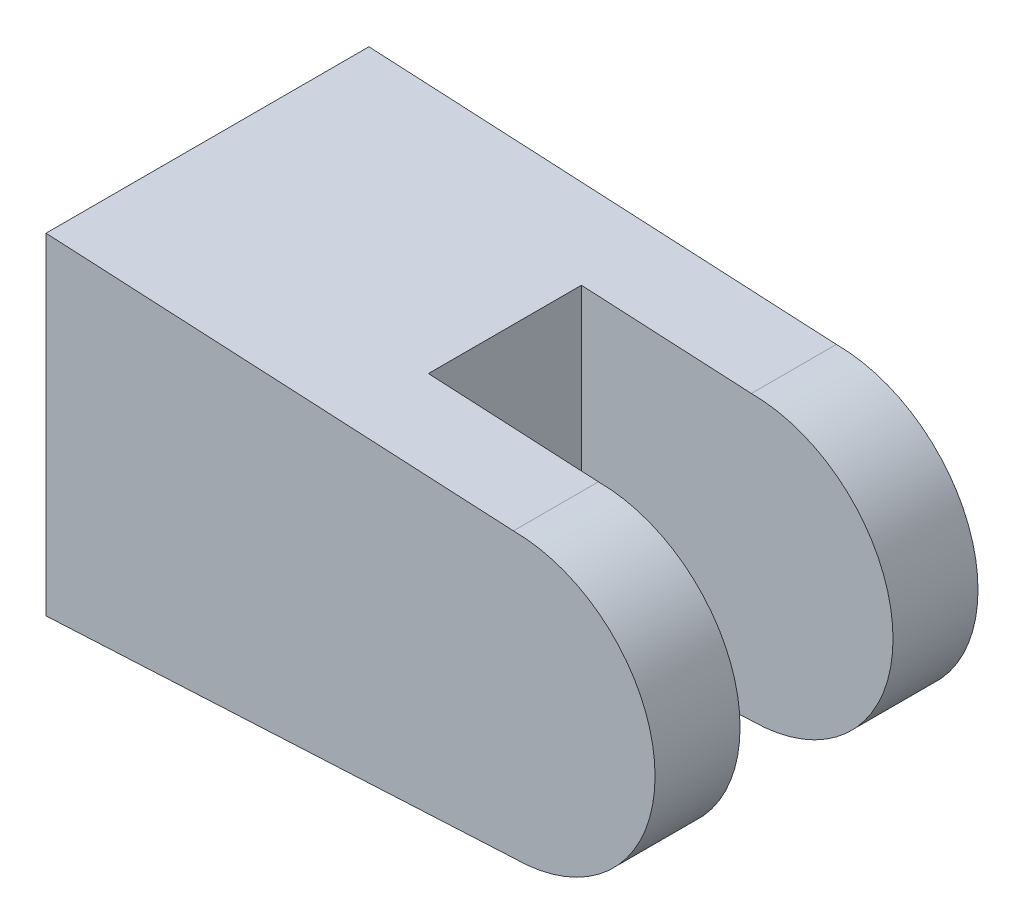
ISO-10303-21;
HEADER;
FILE_DESCRIPTION(('STEP AP214'),'2;1');
FILE_NAME('part.step','',(''),(''),'','','');
FILE_SCHEMA(('AUTOMOTIVE_DESIGN { 1 0 10303 214 1 1 1 1 }'));
ENDSEC;
DATA;
#1=APPLICATION_CONTEXT('core data for automotive mechanical design processes');
#2=APPLICATION_PROTOCOL_DEFINITION('international standard','automotive_design',2000,#1);
#3=PRODUCT_CONTEXT('',#1,'mechanical');
#4=PRODUCT('Part','Part','',(#3));
#5=PRODUCT_RELATED_PRODUCT_CATEGORY('part','',(#4));
#6=PRODUCT_DEFINITION_FORMATION('','',#4);
#7=PRODUCT_DEFINITION_CONTEXT('part definition',#1,'design');
#8=PRODUCT_DEFINITION('design','',#6,#7);
#9=PRODUCT_DEFINITION_SHAPE('','',#8);
#10=(LENGTH_UNIT() NAMED_UNIT(*) SI_UNIT(.MILLI.,.METRE.));
#11=(NAMED_UNIT(*) PLANE_ANGLE_UNIT() SI_UNIT($,.RADIAN.));
#12=(NAMED_UNIT(*) SI_UNIT($,.STERADIAN.) SOLID_ANGLE_UNIT());
#13=UNCERTAINTY_MEASURE_WITH_UNIT(LENGTH_MEASURE(1.E-05),#10,'distance_accuracy_value','');
#14=(GEOMETRIC_REPRESENTATION_CONTEXT(3) GLOBAL_UNCERTAINTY_ASSIGNED_CONTEXT((#13)) GLOBAL_UNIT_ASSIGNED_CONTEXT((#10,
#11,#12)) REPRESENTATION_CONTEXT('',''));
#15=CARTESIAN_POINT('',(0.,0.,0.));
#16=DIRECTION('',(0.,0.,1.));
#17=DIRECTION('',(1.,0.,0.));
#18=AXIS2_PLACEMENT_3D('',#15,#16,#17);
#19=CARTESIAN_POINT('',(0.,0.,57.));
#20=DIRECTION('',(0.,0.,-1.));
#21=DIRECTION('',(-1.,0.,0.));
#22=AXIS2_PLACEMENT_3D('',#19,#20,#21);
#23=CYLINDRICAL_SURFACE('',#22,50.);
#24=DIRECTION('',(0.,0.,-1.));
#25=VECTOR('',#24,1.);
#26=CARTESIAN_POINT('',(0.,-50.,57.));
#27=LINE('',#26,#25);
#28=CARTESIAN_POINT('',(0.,-50.,57.));
#29=VERTEX_POINT('',#28);
#30=CARTESIAN_POINT('',(0.,-50.,27.));
#31=VERTEX_POINT('',#30);
#32=EDGE_CURVE('E155',#29,#31,#27,.T.);
#33=ORIENTED_EDGE('',*,*,#32,.T.);
#34=CARTESIAN_POINT('',(0.,0.,27.));
#35=DIRECTION('',(0.,0.,1.));
#36=DIRECTION('',(1.,0.,0.));
#37=AXIS2_PLACEMENT_3D('',#34,#35,#36);
#38=CIRCLE('',#37,50.);
#39=CARTESIAN_POINT('',(0.,50.,27.));
#40=VERTEX_POINT('',#39);
#41=EDGE_CURVE('E126',#31,#40,#38,.T.);
#42=ORIENTED_EDGE('',*,*,#41,.T.);
#43=DIRECTION('',(0.,0.,-1.));
#44=VECTOR('',#43,1.);
#45=CARTESIAN_POINT('',(0.,50.,57.));
#46=LINE('',#45,#44);
#47=CARTESIAN_POINT('',(0.,50.,57.));
#48=VERTEX_POINT('',#47);
#49=EDGE_CURVE('E141',#48,#40,#46,.T.);
#50=ORIENTED_EDGE('',*,*,#49,.F.);
#51=CARTESIAN_POINT('',(0.,0.,57.));
#52=DIRECTION('',(0.,0.,1.));
#53=DIRECTION('',(1.,0.,0.));
#54=AXIS2_PLACEMENT_3D('',#51,#52,#53);
#55=CIRCLE('',#54,50.);
#56=EDGE_CURVE('E142',#29,#48,#55,.T.);
#57=ORIENTED_EDGE('',*,*,#56,.F.);
#58=EDGE_LOOP('',(#33,#42,#50,#57));
#59=FACE_BOUND('',#58,.T.);
#60=ADVANCED_FACE('F34',(#59),#23,.T.);
#61=CARTESIAN_POINT('',(0.,0.,-27.));
#62=DIRECTION('',(0.,0.,-1.));
#63=DIRECTION('',(-1.,0.,0.));
#64=AXIS2_PLACEMENT_3D('',#61,#62,#63);
#65=CIRCLE('',#64,50.);
#66=CARTESIAN_POINT('',(0.,50.,-27.));
#67=VERTEX_POINT('',#66);
#68=CARTESIAN_POINT('',(0.,-50.,-27.));
#69=VERTEX_POINT('',#68);
#70=EDGE_CURVE('E110',#67,#69,#65,.T.);
#71=ORIENTED_EDGE('',*,*,#70,.T.);
#72=CARTESIAN_POINT('',(0.,-50.,-57.));
#73=VERTEX_POINT('',#72);
#74=EDGE_CURVE('E80',#69,#73,#27,.T.);
#75=ORIENTED_EDGE('',*,*,#74,.T.);
#76=CARTESIAN_POINT('',(0.,0.,-57.));
#77=DIRECTION('',(0.,0.,1.));
#78=DIRECTION('',(1.,0.,0.));
#79=AXIS2_PLACEMENT_3D('',#76,#77,#78);
#80=CIRCLE('',#79,50.);
#81=CARTESIAN_POINT('',(0.,50.,-57.));
#82=VERTEX_POINT('',#81);
#83=EDGE_CURVE('E136',#73,#82,#80,.T.);
#84=ORIENTED_EDGE('',*,*,#83,.T.);
#85=EDGE_CURVE('E164',#67,#82,#46,.T.);
#86=ORIENTED_EDGE('',*,*,#85,.F.);
#87=EDGE_LOOP('',(#71,#75,#84,#86));
#88=FACE_BOUND('',#87,.T.);
#89=ADVANCED_FACE('F36',(#88),#23,.T.);
#90=CARTESIAN_POINT('',(0.,50.,57.));
#91=DIRECTION('',(-0.0514469315337123,-0.998675729772064,0.));
#92=DIRECTION('',(0.998675729772065,-0.0514469315337123,0.));
#93=AXIS2_PLACEMENT_3D('',#90,#91,#92);
#94=PLANE('',#93);
#95=ORIENTED_EDGE('',*,*,#49,.T.);
#96=DIRECTION('',(-0.998675729772065,0.0514469315337123,0.));
#97=VECTOR('',#96,1.);
#98=CARTESIAN_POINT('',(0.,50.,27.));
#99=LINE('',#98,#97);
#100=CARTESIAN_POINT('',(-60.,53.0909090909091,27.));
#101=VERTEX_POINT('',#100);
#102=EDGE_CURVE('E125',#40,#101,#99,.T.);
#103=ORIENTED_EDGE('',*,*,#102,.T.);
#104=DIRECTION('',(0.,0.,-1.));
#105=VECTOR('',#104,1.);
#106=CARTESIAN_POINT('',(-60.,53.0909090909091,57.));
#107=LINE('',#106,#105);
#108=CARTESIAN_POINT('',(-60.,53.0909090909091,-27.));
#109=VERTEX_POINT('',#108);
#110=EDGE_CURVE('E113',#101,#109,#107,.T.);
#111=ORIENTED_EDGE('',*,*,#110,.T.);
#112=DIRECTION('',(0.998675729772065,-0.0514469315337123,0.));
#113=VECTOR('',#112,1.);
#114=CARTESIAN_POINT('',(0.,50.,-27.));
#115=LINE('',#114,#113);
#116=EDGE_CURVE('E108',#109,#67,#115,.T.);
#117=ORIENTED_EDGE('',*,*,#116,.T.);
#118=ORIENTED_EDGE('',*,*,#85,.T.);
#119=DIRECTION('',(-0.998675729772065,0.0514469315337123,0.));
#120=VECTOR('',#119,1.);
#121=CARTESIAN_POINT('',(0.,50.,-57.));
#122=LINE('',#121,#120);
#123=CARTESIAN_POINT('',(-165.,58.5,-57.));
#124=VERTEX_POINT('',#123);
#125=EDGE_CURVE('E150',#82,#124,#122,.T.);
#126=ORIENTED_EDGE('',*,*,#125,.T.);
#127=DIRECTION('',(0.,0.,-1.));
#128=VECTOR('',#127,1.);
#129=CARTESIAN_POINT('',(-165.,58.5,57.));
#130=LINE('',#129,#128);
#131=CARTESIAN_POINT('',(-165.,58.5,57.));
#132=VERTEX_POINT('',#131);
#133=EDGE_CURVE('E161',#132,#124,#130,.T.);
#134=ORIENTED_EDGE('',*,*,#133,.F.);
#135=DIRECTION('',(-0.998675729772065,0.0514469315337123,0.));
#136=VECTOR('',#135,1.);
#137=CARTESIAN_POINT('',(0.,50.,57.));
#138=LINE('',#137,#136);
#139=EDGE_CURVE('E88',#48,#132,#138,.T.);
#140=ORIENTED_EDGE('',*,*,#139,.F.);
#141=EDGE_LOOP('',(#95,#103,#111,#117,#118,#126,#134,#140));
#142=FACE_BOUND('',#141,.T.);
#143=ADVANCED_FACE('F124',(#142),#94,.F.);
#144=CARTESIAN_POINT('',(-165.,58.5,57.));
#145=DIRECTION('',(1.,0.,0.));
#146=DIRECTION('',(0.,0.,-1.));
#147=AXIS2_PLACEMENT_3D('',#144,#145,#146);
#148=PLANE('',#147);
#149=CARTESIAN_POINT('',(-165.,0.,0.));
#150=DIRECTION('',(-1.,0.,0.));
#151=DIRECTION('',(0.,0.,1.));
#152=AXIS2_PLACEMENT_3D('',#149,#150,#151);
#153=CIRCLE('',#152,37.5);
#154=CARTESIAN_POINT('',(-165.,0.,37.5));
#155=VERTEX_POINT('',#154);
#156=EDGE_CURVE('E137',#155,#155,#153,.T.);
#157=ORIENTED_EDGE('',*,*,#156,.F.);
#158=EDGE_LOOP('',(#157));
#159=FACE_BOUND('',#158,.T.);
#160=DIRECTION('',(0.,-1.,0.));
#161=VECTOR('',#160,1.);
#162=CARTESIAN_POINT('',(-165.,58.5,-57.));
#163=LINE('',#162,#161);
#164=CARTESIAN_POINT('',(-165.,-58.5,-57.));
#165=VERTEX_POINT('',#164);
#166=EDGE_CURVE('E152',#124,#165,#163,.T.);
#167=ORIENTED_EDGE('',*,*,#166,.T.);
#168=DIRECTION('',(0.,0.,-1.));
#169=VECTOR('',#168,1.);
#170=CARTESIAN_POINT('',(-165.,-58.5,57.));
#171=LINE('',#170,#169);
#172=CARTESIAN_POINT('',(-165.,-58.5,57.));
#173=VERTEX_POINT('',#172);
#174=EDGE_CURVE('E158',#173,#165,#171,.T.);
#175=ORIENTED_EDGE('',*,*,#174,.F.);
#176=DIRECTION('',(0.,-1.,0.));
#177=VECTOR('',#176,1.);
#178=CARTESIAN_POINT('',(-165.,58.5,57.));
#179=LINE('',#178,#177);
#180=EDGE_CURVE('E146',#132,#173,#179,.T.);
#181=ORIENTED_EDGE('',*,*,#180,.F.);
#182=ORIENTED_EDGE('',*,*,#133,.T.);
#183=EDGE_LOOP('',(#167,#175,#181,#182));
#184=FACE_BOUND('',#183,.T.);
#185=ADVANCED_FACE('F177',(#159,#184),#148,.F.);
#186=CARTESIAN_POINT('',(0.,-50.,57.));
#187=DIRECTION('',(-0.0514469315337123,0.998675729772064,0.));
#188=DIRECTION('',(-0.998675729772065,-0.0514469315337123,0.));
#189=AXIS2_PLACEMENT_3D('',#186,#187,#188);
#190=PLANE('',#189);
#191=DIRECTION('',(0.,0.,1.));
#192=VECTOR('',#191,1.);
#193=CARTESIAN_POINT('',(-60.,-53.0909090909091,57.));
#194=LINE('',#193,#192);
#195=CARTESIAN_POINT('',(-60.,-53.0909090909091,-27.));
#196=VERTEX_POINT('',#195);
#197=CARTESIAN_POINT('',(-60.,-53.0909090909091,27.));
#198=VERTEX_POINT('',#197);
#199=EDGE_CURVE('E42',#196,#198,#194,.T.);
#200=ORIENTED_EDGE('',*,*,#199,.T.);
#201=DIRECTION('',(0.998675729772065,0.0514469315337123,0.));
#202=VECTOR('',#201,1.);
#203=CARTESIAN_POINT('',(0.,-50.,27.));
#204=LINE('',#203,#202);
#205=EDGE_CURVE('E11',#198,#31,#204,.T.);
#206=ORIENTED_EDGE('',*,*,#205,.T.);
#207=ORIENTED_EDGE('',*,*,#32,.F.);
#208=DIRECTION('',(0.998675729772065,0.0514469315337123,0.));
#209=VECTOR('',#208,1.);
#210=CARTESIAN_POINT('',(0.,-50.,57.));
#211=LINE('',#210,#209);
#212=EDGE_CURVE('E58',#173,#29,#211,.T.);
#213=ORIENTED_EDGE('',*,*,#212,.F.);
#214=ORIENTED_EDGE('',*,*,#174,.T.);
#215=DIRECTION('',(0.998675729772065,0.0514469315337123,0.));
#216=VECTOR('',#215,1.);
#217=CARTESIAN_POINT('',(0.,-50.,-57.));
#218=LINE('',#217,#216);
#219=EDGE_CURVE('E144',#165,#73,#218,.T.);
#220=ORIENTED_EDGE('',*,*,#219,.T.);
#221=ORIENTED_EDGE('',*,*,#74,.F.);
#222=DIRECTION('',(-0.998675729772065,-0.0514469315337123,0.));
#223=VECTOR('',#222,1.);
#224=CARTESIAN_POINT('',(0.,-50.,-27.));
#225=LINE('',#224,#223);
#226=EDGE_CURVE('E140',#69,#196,#225,.T.);
#227=ORIENTED_EDGE('',*,*,#226,.T.);
#228=EDGE_LOOP('',(#200,#206,#207,#213,#214,#220,#221,#227));
#229=FACE_BOUND('',#228,.T.);
#230=ADVANCED_FACE('F167',(#229),#190,.F.);
#231=CARTESIAN_POINT('',(0.,0.,57.));
#232=DIRECTION('',(0.,0.,1.));
#233=DIRECTION('',(1.,0.,0.));
#234=AXIS2_PLACEMENT_3D('',#231,#232,#233);
#235=PLANE('',#234);
#236=ORIENTED_EDGE('',*,*,#56,.T.);
#237=ORIENTED_EDGE('',*,*,#139,.T.);
#238=ORIENTED_EDGE('',*,*,#180,.T.);
#239=ORIENTED_EDGE('',*,*,#212,.T.);
#240=EDGE_LOOP('',(#236,#237,#238,#239));
#241=FACE_BOUND('',#240,.T.);
#242=ADVANCED_FACE('F178',(#241),#235,.T.);
#243=CARTESIAN_POINT('',(0.,0.,-57.));
#244=DIRECTION('',(0.,0.,1.));
#245=DIRECTION('',(1.,0.,0.));
#246=AXIS2_PLACEMENT_3D('',#243,#244,#245);
#247=PLANE('',#246);
#248=ORIENTED_EDGE('',*,*,#83,.F.);
#249=ORIENTED_EDGE('',*,*,#219,.F.);
#250=ORIENTED_EDGE('',*,*,#166,.F.);
#251=ORIENTED_EDGE('',*,*,#125,.F.);
#252=EDGE_LOOP('',(#248,#249,#250,#251));
#253=FACE_BOUND('',#252,.T.);
#254=ADVANCED_FACE('F174',(#253),#247,.F.);
#255=CARTESIAN_POINT('',(-167.,0.,0.));
#256=DIRECTION('',(1.,0.,0.));
#257=DIRECTION('',(0.,0.,-1.));
#258=AXIS2_PLACEMENT_3D('',#255,#256,#257);
#259=CYLINDRICAL_SURFACE('',#258,37.5);
#260=CARTESIAN_POINT('',(-167.,0.,0.));
#261=DIRECTION('',(-1.,0.,0.));
#262=DIRECTION('',(0.,0.,1.));
#263=AXIS2_PLACEMENT_3D('',#260,#261,#262);
#264=CIRCLE('',#263,37.5);
#265=CARTESIAN_POINT('',(-167.,0.,37.5));
#266=VERTEX_POINT('',#265);
#267=EDGE_CURVE('E133',#266,#266,#264,.T.);
#268=ORIENTED_EDGE('',*,*,#267,.F.);
#269=EDGE_LOOP('',(#268));
#270=FACE_BOUND('',#269,.T.);
#271=ORIENTED_EDGE('',*,*,#156,.T.);
#272=EDGE_LOOP('',(#271));
#273=FACE_BOUND('',#272,.T.);
#274=ADVANCED_FACE('F193',(#270,#273),#259,.T.);
#275=CARTESIAN_POINT('',(-167.,0.,0.));
#276=DIRECTION('',(-1.,0.,0.));
#277=DIRECTION('',(0.,0.,1.));
#278=AXIS2_PLACEMENT_3D('',#275,#276,#277);
#279=PLANE('',#278);
#280=ORIENTED_EDGE('',*,*,#267,.T.);
#281=EDGE_LOOP('',(#280));
#282=FACE_BOUND('',#281,.T.);
#283=ADVANCED_FACE('F186',(#282),#279,.T.);
#284=CARTESIAN_POINT('',(50.,-58.5,27.));
#285=DIRECTION('',(0.,0.,1.));
#286=DIRECTION('',(1.,0.,0.));
#287=AXIS2_PLACEMENT_3D('',#284,#285,#286);
#288=PLANE('',#287);
#289=ORIENTED_EDGE('',*,*,#41,.F.);
#290=ORIENTED_EDGE('',*,*,#205,.F.);
#291=DIRECTION('',(0.,1.,0.));
#292=VECTOR('',#291,1.);
#293=CARTESIAN_POINT('',(-60.,-58.5,27.));
#294=LINE('',#293,#292);
#295=EDGE_CURVE('E121',#198,#101,#294,.T.);
#296=ORIENTED_EDGE('',*,*,#295,.T.);
#297=ORIENTED_EDGE('',*,*,#102,.F.);
#298=EDGE_LOOP('',(#289,#290,#296,#297));
#299=FACE_BOUND('',#298,.T.);
#300=ADVANCED_FACE('F183',(#299),#288,.F.);
#301=CARTESIAN_POINT('',(-60.,-58.5,-27.));
#302=DIRECTION('',(-1.,0.,0.));
#303=DIRECTION('',(0.,0.,1.));
#304=AXIS2_PLACEMENT_3D('',#301,#302,#303);
#305=PLANE('',#304);
#306=ORIENTED_EDGE('',*,*,#295,.F.);
#307=ORIENTED_EDGE('',*,*,#199,.F.);
#308=DIRECTION('',(0.,1.,0.));
#309=VECTOR('',#308,1.);
#310=CARTESIAN_POINT('',(-60.,-58.5,-27.));
#311=LINE('',#310,#309);
#312=EDGE_CURVE('E49',#196,#109,#311,.T.);
#313=ORIENTED_EDGE('',*,*,#312,.T.);
#314=ORIENTED_EDGE('',*,*,#110,.F.);
#315=EDGE_LOOP('',(#306,#307,#313,#314));
#316=FACE_BOUND('',#315,.T.);
#317=ADVANCED_FACE('F117',(#316),#305,.F.);
#318=CARTESIAN_POINT('',(50.,-58.5,-27.));
#319=DIRECTION('',(0.,0.,-1.));
#320=DIRECTION('',(-1.,0.,0.));
#321=AXIS2_PLACEMENT_3D('',#318,#319,#320);
#322=PLANE('',#321);
#323=ORIENTED_EDGE('',*,*,#312,.F.);
#324=ORIENTED_EDGE('',*,*,#226,.F.);
#325=ORIENTED_EDGE('',*,*,#70,.F.);
#326=ORIENTED_EDGE('',*,*,#116,.F.);
#327=EDGE_LOOP('',(#323,#324,#325,#326));
#328=FACE_BOUND('',#327,.T.);
#329=ADVANCED_FACE('F109',(#328),#322,.F.);
#330=CLOSED_SHELL('',(#60,#89,#143,#185,#230,#242,#254,#274,#283,#300,#317,#329));
#331=MANIFOLD_SOLID_BREP('B2',#330);
#332=ADVANCED_BREP_SHAPE_REPRESENTATION('',(#18,#331),#14);
#333=SHAPE_DEFINITION_REPRESENTATION(#9,#332);
ENDSEC;
END-ISO-10303-21;
